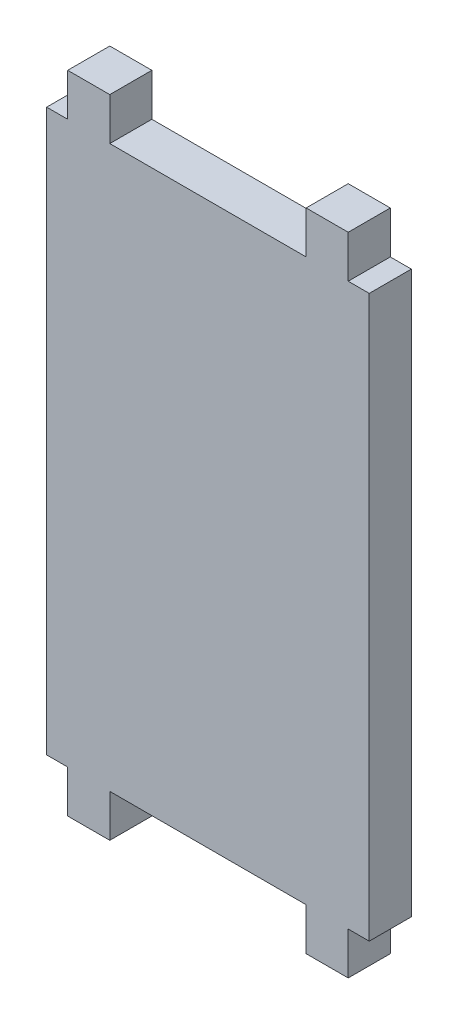
ISO-10303-21;
HEADER;
FILE_DESCRIPTION(('STEP AP214'),'2;1');
FILE_NAME('part.step','',(''),(''),'','','');
FILE_SCHEMA(('AUTOMOTIVE_DESIGN { 1 0 10303 214 1 1 1 1 }'));
ENDSEC;
DATA;
#1=APPLICATION_CONTEXT('core data for automotive mechanical design processes');
#2=APPLICATION_PROTOCOL_DEFINITION('international standard','automotive_design',2000,#1);
#3=PRODUCT_CONTEXT('',#1,'mechanical');
#4=PRODUCT('Part','Part','',(#3));
#5=PRODUCT_RELATED_PRODUCT_CATEGORY('part','',(#4));
#6=PRODUCT_DEFINITION_FORMATION('','',#4);
#7=PRODUCT_DEFINITION_CONTEXT('part definition',#1,'design');
#8=PRODUCT_DEFINITION('design','',#6,#7);
#9=PRODUCT_DEFINITION_SHAPE('','',#8);
#10=(LENGTH_UNIT() NAMED_UNIT(*) SI_UNIT(.MILLI.,.METRE.));
#11=(NAMED_UNIT(*) PLANE_ANGLE_UNIT() SI_UNIT($,.RADIAN.));
#12=(NAMED_UNIT(*) SI_UNIT($,.STERADIAN.) SOLID_ANGLE_UNIT());
#13=UNCERTAINTY_MEASURE_WITH_UNIT(LENGTH_MEASURE(1.E-05),#10,'distance_accuracy_value','');
#14=(GEOMETRIC_REPRESENTATION_CONTEXT(3) GLOBAL_UNCERTAINTY_ASSIGNED_CONTEXT((#13)) GLOBAL_UNIT_ASSIGNED_CONTEXT((#10,
#11,#12)) REPRESENTATION_CONTEXT('',''));
#15=CARTESIAN_POINT('',(0.,0.,0.));
#16=DIRECTION('',(0.,0.,1.));
#17=DIRECTION('',(1.,0.,0.));
#18=AXIS2_PLACEMENT_3D('',#15,#16,#17);
#19=CARTESIAN_POINT('',(70.,90.,6.));
#20=DIRECTION('',(0.,-1.,0.));
#21=DIRECTION('',(0.,0.,-1.));
#22=AXIS2_PLACEMENT_3D('',#19,#20,#21);
#23=PLANE('',#22);
#24=DIRECTION('',(-1.,0.,0.));
#25=VECTOR('',#24,1.);
#26=CARTESIAN_POINT('',(70.,90.,0.));
#27=LINE('',#26,#25);
#28=CARTESIAN_POINT('',(73.,90.,0.));
#29=VERTEX_POINT('',#28);
#30=CARTESIAN_POINT('',(70.,90.,0.));
#31=VERTEX_POINT('',#30);
#32=EDGE_CURVE('E202',#29,#31,#27,.T.);
#33=ORIENTED_EDGE('',*,*,#32,.T.);
#34=DIRECTION('',(0.,0.,-1.));
#35=VECTOR('',#34,1.);
#36=CARTESIAN_POINT('',(70.,90.,6.));
#37=LINE('',#36,#35);
#38=CARTESIAN_POINT('',(70.,90.,6.));
#39=VERTEX_POINT('',#38);
#40=EDGE_CURVE('E11',#39,#31,#37,.T.);
#41=ORIENTED_EDGE('',*,*,#40,.F.);
#42=DIRECTION('',(-1.,0.,0.));
#43=VECTOR('',#42,1.);
#44=CARTESIAN_POINT('',(70.,90.,6.));
#45=LINE('',#44,#43);
#46=CARTESIAN_POINT('',(73.,90.,6.));
#47=VERTEX_POINT('',#46);
#48=EDGE_CURVE('E240',#47,#39,#45,.T.);
#49=ORIENTED_EDGE('',*,*,#48,.F.);
#50=DIRECTION('',(0.,0.,-1.));
#51=VECTOR('',#50,1.);
#52=CARTESIAN_POINT('',(73.,90.,6.));
#53=LINE('',#52,#51);
#54=EDGE_CURVE('E198',#47,#29,#53,.T.);
#55=ORIENTED_EDGE('',*,*,#54,.T.);
#56=EDGE_LOOP('',(#33,#41,#49,#55));
#57=FACE_BOUND('',#56,.T.);
#58=ADVANCED_FACE('F34',(#57),#23,.F.);
#59=CARTESIAN_POINT('',(70.,96.05,6.));
#60=DIRECTION('',(-1.,0.,0.));
#61=DIRECTION('',(0.,0.,1.));
#62=AXIS2_PLACEMENT_3D('',#59,#60,#61);
#63=PLANE('',#62);
#64=DIRECTION('',(0.,1.,0.));
#65=VECTOR('',#64,1.);
#66=CARTESIAN_POINT('',(70.,96.05,0.));
#67=LINE('',#66,#65);
#68=CARTESIAN_POINT('',(70.,96.05,0.));
#69=VERTEX_POINT('',#68);
#70=EDGE_CURVE('E205',#31,#69,#67,.T.);
#71=ORIENTED_EDGE('',*,*,#70,.T.);
#72=DIRECTION('',(0.,0.,-1.));
#73=VECTOR('',#72,1.);
#74=CARTESIAN_POINT('',(70.,96.05,6.));
#75=LINE('',#74,#73);
#76=CARTESIAN_POINT('',(70.,96.05,6.));
#77=VERTEX_POINT('',#76);
#78=EDGE_CURVE('E42',#77,#69,#75,.T.);
#79=ORIENTED_EDGE('',*,*,#78,.F.);
#80=DIRECTION('',(0.,1.,0.));
#81=VECTOR('',#80,1.);
#82=CARTESIAN_POINT('',(70.,96.05,6.));
#83=LINE('',#82,#81);
#84=EDGE_CURVE('E129',#39,#77,#83,.T.);
#85=ORIENTED_EDGE('',*,*,#84,.F.);
#86=ORIENTED_EDGE('',*,*,#40,.T.);
#87=EDGE_LOOP('',(#71,#79,#85,#86));
#88=FACE_BOUND('',#87,.T.);
#89=ADVANCED_FACE('F358',(#88),#63,.F.);
#90=CARTESIAN_POINT('',(64.,96.05,6.));
#91=DIRECTION('',(0.,-1.,0.));
#92=DIRECTION('',(0.,0.,-1.));
#93=AXIS2_PLACEMENT_3D('',#90,#91,#92);
#94=PLANE('',#93);
#95=DIRECTION('',(-1.,0.,0.));
#96=VECTOR('',#95,1.);
#97=CARTESIAN_POINT('',(64.,96.05,0.));
#98=LINE('',#97,#96);
#99=CARTESIAN_POINT('',(64.,96.05,0.));
#100=VERTEX_POINT('',#99);
#101=EDGE_CURVE('E207',#69,#100,#98,.T.);
#102=ORIENTED_EDGE('',*,*,#101,.T.);
#103=DIRECTION('',(0.,0.,-1.));
#104=VECTOR('',#103,1.);
#105=CARTESIAN_POINT('',(64.,96.05,6.));
#106=LINE('',#105,#104);
#107=CARTESIAN_POINT('',(64.,96.05,6.));
#108=VERTEX_POINT('',#107);
#109=EDGE_CURVE('E283',#108,#100,#106,.T.);
#110=ORIENTED_EDGE('',*,*,#109,.F.);
#111=DIRECTION('',(-1.,0.,0.));
#112=VECTOR('',#111,1.);
#113=CARTESIAN_POINT('',(64.,96.05,6.));
#114=LINE('',#113,#112);
#115=EDGE_CURVE('E291',#77,#108,#114,.T.);
#116=ORIENTED_EDGE('',*,*,#115,.F.);
#117=ORIENTED_EDGE('',*,*,#78,.T.);
#118=EDGE_LOOP('',(#102,#110,#116,#117));
#119=FACE_BOUND('',#118,.T.);
#120=ADVANCED_FACE('F289',(#119),#94,.F.);
#121=CARTESIAN_POINT('',(64.,96.05,6.));
#122=DIRECTION('',(1.,0.,0.));
#123=DIRECTION('',(0.,0.,-1.));
#124=AXIS2_PLACEMENT_3D('',#121,#122,#123);
#125=PLANE('',#124);
#126=DIRECTION('',(0.,-1.,0.));
#127=VECTOR('',#126,1.);
#128=CARTESIAN_POINT('',(64.,96.05,0.));
#129=LINE('',#128,#127);
#130=CARTESIAN_POINT('',(64.,90.,0.));
#131=VERTEX_POINT('',#130);
#132=EDGE_CURVE('E209',#100,#131,#129,.T.);
#133=ORIENTED_EDGE('',*,*,#132,.T.);
#134=DIRECTION('',(0.,0.,-1.));
#135=VECTOR('',#134,1.);
#136=CARTESIAN_POINT('',(64.,90.,6.));
#137=LINE('',#136,#135);
#138=CARTESIAN_POINT('',(64.,90.,6.));
#139=VERTEX_POINT('',#138);
#140=EDGE_CURVE('E280',#139,#131,#137,.T.);
#141=ORIENTED_EDGE('',*,*,#140,.F.);
#142=DIRECTION('',(0.,-1.,0.));
#143=VECTOR('',#142,1.);
#144=CARTESIAN_POINT('',(64.,96.05,6.));
#145=LINE('',#144,#143);
#146=EDGE_CURVE('E309',#108,#139,#145,.T.);
#147=ORIENTED_EDGE('',*,*,#146,.F.);
#148=ORIENTED_EDGE('',*,*,#109,.T.);
#149=EDGE_LOOP('',(#133,#141,#147,#148));
#150=FACE_BOUND('',#149,.T.);
#151=ADVANCED_FACE('F300',(#150),#125,.F.);
#152=CARTESIAN_POINT('',(36.,90.,6.));
#153=DIRECTION('',(0.,-1.,0.));
#154=DIRECTION('',(1.,0.,0.));
#155=AXIS2_PLACEMENT_3D('',#152,#153,#154);
#156=PLANE('',#155);
#157=DIRECTION('',(-1.,0.,0.));
#158=VECTOR('',#157,1.);
#159=CARTESIAN_POINT('',(36.,90.,0.));
#160=LINE('',#159,#158);
#161=CARTESIAN_POINT('',(36.,90.,0.));
#162=VERTEX_POINT('',#161);
#163=EDGE_CURVE('E211',#131,#162,#160,.T.);
#164=ORIENTED_EDGE('',*,*,#163,.T.);
#165=DIRECTION('',(0.,0.,-1.));
#166=VECTOR('',#165,1.);
#167=CARTESIAN_POINT('',(36.,90.,6.));
#168=LINE('',#167,#166);
#169=CARTESIAN_POINT('',(36.,90.,6.));
#170=VERTEX_POINT('',#169);
#171=EDGE_CURVE('E277',#170,#162,#168,.T.);
#172=ORIENTED_EDGE('',*,*,#171,.F.);
#173=DIRECTION('',(-1.,0.,0.));
#174=VECTOR('',#173,1.);
#175=CARTESIAN_POINT('',(36.,90.,6.));
#176=LINE('',#175,#174);
#177=EDGE_CURVE('E306',#139,#170,#176,.T.);
#178=ORIENTED_EDGE('',*,*,#177,.F.);
#179=ORIENTED_EDGE('',*,*,#140,.T.);
#180=EDGE_LOOP('',(#164,#172,#178,#179));
#181=FACE_BOUND('',#180,.T.);
#182=ADVANCED_FACE('F304',(#181),#156,.F.);
#183=CARTESIAN_POINT('',(36.,96.05,6.));
#184=DIRECTION('',(-1.,0.,0.));
#185=DIRECTION('',(0.,0.,1.));
#186=AXIS2_PLACEMENT_3D('',#183,#184,#185);
#187=PLANE('',#186);
#188=DIRECTION('',(0.,1.,0.));
#189=VECTOR('',#188,1.);
#190=CARTESIAN_POINT('',(36.,96.05,0.));
#191=LINE('',#190,#189);
#192=CARTESIAN_POINT('',(36.,96.05,0.));
#193=VERTEX_POINT('',#192);
#194=EDGE_CURVE('E213',#162,#193,#191,.T.);
#195=ORIENTED_EDGE('',*,*,#194,.T.);
#196=DIRECTION('',(0.,0.,-1.));
#197=VECTOR('',#196,1.);
#198=CARTESIAN_POINT('',(36.,96.05,6.));
#199=LINE('',#198,#197);
#200=CARTESIAN_POINT('',(36.,96.05,6.));
#201=VERTEX_POINT('',#200);
#202=EDGE_CURVE('E274',#201,#193,#199,.T.);
#203=ORIENTED_EDGE('',*,*,#202,.F.);
#204=DIRECTION('',(0.,1.,0.));
#205=VECTOR('',#204,1.);
#206=CARTESIAN_POINT('',(36.,96.05,6.));
#207=LINE('',#206,#205);
#208=EDGE_CURVE('E308',#170,#201,#207,.T.);
#209=ORIENTED_EDGE('',*,*,#208,.F.);
#210=ORIENTED_EDGE('',*,*,#171,.T.);
#211=EDGE_LOOP('',(#195,#203,#209,#210));
#212=FACE_BOUND('',#211,.T.);
#213=ADVANCED_FACE('F371',(#212),#187,.F.);
#214=CARTESIAN_POINT('',(30.,96.05,6.));
#215=DIRECTION('',(0.,-1.,0.));
#216=DIRECTION('',(0.,0.,-1.));
#217=AXIS2_PLACEMENT_3D('',#214,#215,#216);
#218=PLANE('',#217);
#219=DIRECTION('',(-1.,0.,0.));
#220=VECTOR('',#219,1.);
#221=CARTESIAN_POINT('',(30.,96.05,0.));
#222=LINE('',#221,#220);
#223=CARTESIAN_POINT('',(30.,96.05,0.));
#224=VERTEX_POINT('',#223);
#225=EDGE_CURVE('E215',#193,#224,#222,.T.);
#226=ORIENTED_EDGE('',*,*,#225,.T.);
#227=DIRECTION('',(0.,0.,-1.));
#228=VECTOR('',#227,1.);
#229=CARTESIAN_POINT('',(30.,96.05,6.));
#230=LINE('',#229,#228);
#231=CARTESIAN_POINT('',(30.,96.05,6.));
#232=VERTEX_POINT('',#231);
#233=EDGE_CURVE('E271',#232,#224,#230,.T.);
#234=ORIENTED_EDGE('',*,*,#233,.F.);
#235=DIRECTION('',(-1.,0.,0.));
#236=VECTOR('',#235,1.);
#237=CARTESIAN_POINT('',(30.,96.05,6.));
#238=LINE('',#237,#236);
#239=EDGE_CURVE('E311',#201,#232,#238,.T.);
#240=ORIENTED_EDGE('',*,*,#239,.F.);
#241=ORIENTED_EDGE('',*,*,#202,.T.);
#242=EDGE_LOOP('',(#226,#234,#240,#241));
#243=FACE_BOUND('',#242,.T.);
#244=ADVANCED_FACE('F374',(#243),#218,.F.);
#245=CARTESIAN_POINT('',(30.,96.05,6.));
#246=DIRECTION('',(1.,0.,0.));
#247=DIRECTION('',(0.,0.,-1.));
#248=AXIS2_PLACEMENT_3D('',#245,#246,#247);
#249=PLANE('',#248);
#250=DIRECTION('',(0.,-1.,0.));
#251=VECTOR('',#250,1.);
#252=CARTESIAN_POINT('',(30.,96.05,0.));
#253=LINE('',#252,#251);
#254=CARTESIAN_POINT('',(30.,90.,0.));
#255=VERTEX_POINT('',#254);
#256=EDGE_CURVE('E217',#224,#255,#253,.T.);
#257=ORIENTED_EDGE('',*,*,#256,.T.);
#258=DIRECTION('',(0.,0.,-1.));
#259=VECTOR('',#258,1.);
#260=CARTESIAN_POINT('',(30.,90.,6.));
#261=LINE('',#260,#259);
#262=CARTESIAN_POINT('',(30.,90.,6.));
#263=VERTEX_POINT('',#262);
#264=EDGE_CURVE('E268',#263,#255,#261,.T.);
#265=ORIENTED_EDGE('',*,*,#264,.F.);
#266=DIRECTION('',(0.,-1.,0.));
#267=VECTOR('',#266,1.);
#268=CARTESIAN_POINT('',(30.,96.05,6.));
#269=LINE('',#268,#267);
#270=EDGE_CURVE('E317',#232,#263,#269,.T.);
#271=ORIENTED_EDGE('',*,*,#270,.F.);
#272=ORIENTED_EDGE('',*,*,#233,.T.);
#273=EDGE_LOOP('',(#257,#265,#271,#272));
#274=FACE_BOUND('',#273,.T.);
#275=ADVANCED_FACE('F378',(#274),#249,.F.);
#276=CARTESIAN_POINT('',(27.,90.,6.));
#277=DIRECTION('',(0.,-1.,0.));
#278=DIRECTION('',(0.,0.,-1.));
#279=AXIS2_PLACEMENT_3D('',#276,#277,#278);
#280=PLANE('',#279);
#281=DIRECTION('',(-1.,0.,0.));
#282=VECTOR('',#281,1.);
#283=CARTESIAN_POINT('',(27.,90.,0.));
#284=LINE('',#283,#282);
#285=CARTESIAN_POINT('',(27.,90.,0.));
#286=VERTEX_POINT('',#285);
#287=EDGE_CURVE('E219',#255,#286,#284,.T.);
#288=ORIENTED_EDGE('',*,*,#287,.T.);
#289=DIRECTION('',(0.,0.,-1.));
#290=VECTOR('',#289,1.);
#291=CARTESIAN_POINT('',(27.,90.,6.));
#292=LINE('',#291,#290);
#293=CARTESIAN_POINT('',(27.,90.,6.));
#294=VERTEX_POINT('',#293);
#295=EDGE_CURVE('E265',#294,#286,#292,.T.);
#296=ORIENTED_EDGE('',*,*,#295,.F.);
#297=DIRECTION('',(-1.,0.,0.));
#298=VECTOR('',#297,1.);
#299=CARTESIAN_POINT('',(27.,90.,6.));
#300=LINE('',#299,#298);
#301=EDGE_CURVE('E319',#263,#294,#300,.T.);
#302=ORIENTED_EDGE('',*,*,#301,.F.);
#303=ORIENTED_EDGE('',*,*,#264,.T.);
#304=EDGE_LOOP('',(#288,#296,#302,#303));
#305=FACE_BOUND('',#304,.T.);
#306=ADVANCED_FACE('F382',(#305),#280,.F.);
#307=CARTESIAN_POINT('',(27.,90.,6.));
#308=DIRECTION('',(1.,0.,0.));
#309=DIRECTION('',(0.,1.,0.));
#310=AXIS2_PLACEMENT_3D('',#307,#308,#309);
#311=PLANE('',#310);
#312=DIRECTION('',(0.,-1.,0.));
#313=VECTOR('',#312,1.);
#314=CARTESIAN_POINT('',(27.,90.,0.));
#315=LINE('',#314,#313);
#316=CARTESIAN_POINT('',(27.,9.99999999999997,0.));
#317=VERTEX_POINT('',#316);
#318=EDGE_CURVE('E221',#286,#317,#315,.T.);
#319=ORIENTED_EDGE('',*,*,#318,.T.);
#320=DIRECTION('',(0.,0.,-1.));
#321=VECTOR('',#320,1.);
#322=CARTESIAN_POINT('',(27.,9.99999999999997,6.));
#323=LINE('',#322,#321);
#324=CARTESIAN_POINT('',(27.,9.99999999999997,6.));
#325=VERTEX_POINT('',#324);
#326=EDGE_CURVE('E262',#325,#317,#323,.T.);
#327=ORIENTED_EDGE('',*,*,#326,.F.);
#328=DIRECTION('',(0.,-1.,0.));
#329=VECTOR('',#328,1.);
#330=CARTESIAN_POINT('',(27.,90.,6.));
#331=LINE('',#330,#329);
#332=EDGE_CURVE('E321',#294,#325,#331,.T.);
#333=ORIENTED_EDGE('',*,*,#332,.F.);
#334=ORIENTED_EDGE('',*,*,#295,.T.);
#335=EDGE_LOOP('',(#319,#327,#333,#334));
#336=FACE_BOUND('',#335,.T.);
#337=ADVANCED_FACE('F386',(#336),#311,.F.);
#338=CARTESIAN_POINT('',(27.,9.99999999999997,6.));
#339=DIRECTION('',(0.,1.,0.));
#340=DIRECTION('',(0.,0.,1.));
#341=AXIS2_PLACEMENT_3D('',#338,#339,#340);
#342=PLANE('',#341);
#343=DIRECTION('',(1.,0.,0.));
#344=VECTOR('',#343,1.);
#345=CARTESIAN_POINT('',(27.,9.99999999999997,0.));
#346=LINE('',#345,#344);
#347=CARTESIAN_POINT('',(30.,9.99999999999997,0.));
#348=VERTEX_POINT('',#347);
#349=EDGE_CURVE('E223',#317,#348,#346,.T.);
#350=ORIENTED_EDGE('',*,*,#349,.T.);
#351=DIRECTION('',(0.,0.,-1.));
#352=VECTOR('',#351,1.);
#353=CARTESIAN_POINT('',(30.,9.99999999999997,6.));
#354=LINE('',#353,#352);
#355=CARTESIAN_POINT('',(30.,9.99999999999997,6.));
#356=VERTEX_POINT('',#355);
#357=EDGE_CURVE('E259',#356,#348,#354,.T.);
#358=ORIENTED_EDGE('',*,*,#357,.F.);
#359=DIRECTION('',(1.,0.,0.));
#360=VECTOR('',#359,1.);
#361=CARTESIAN_POINT('',(27.,9.99999999999997,6.));
#362=LINE('',#361,#360);
#363=EDGE_CURVE('E323',#325,#356,#362,.T.);
#364=ORIENTED_EDGE('',*,*,#363,.F.);
#365=ORIENTED_EDGE('',*,*,#326,.T.);
#366=EDGE_LOOP('',(#350,#358,#364,#365));
#367=FACE_BOUND('',#366,.T.);
#368=ADVANCED_FACE('F390',(#367),#342,.F.);
#369=CARTESIAN_POINT('',(30.,9.99999999999997,6.));
#370=DIRECTION('',(1.,0.,0.));
#371=DIRECTION('',(0.,0.,-1.));
#372=AXIS2_PLACEMENT_3D('',#369,#370,#371);
#373=PLANE('',#372);
#374=DIRECTION('',(0.,-1.,0.));
#375=VECTOR('',#374,1.);
#376=CARTESIAN_POINT('',(30.,9.99999999999997,0.));
#377=LINE('',#376,#375);
#378=CARTESIAN_POINT('',(30.,3.94999999999996,0.));
#379=VERTEX_POINT('',#378);
#380=EDGE_CURVE('E225',#348,#379,#377,.T.);
#381=ORIENTED_EDGE('',*,*,#380,.T.);
#382=DIRECTION('',(0.,0.,-1.));
#383=VECTOR('',#382,1.);
#384=CARTESIAN_POINT('',(30.,3.94999999999996,6.));
#385=LINE('',#384,#383);
#386=CARTESIAN_POINT('',(30.,3.94999999999996,6.));
#387=VERTEX_POINT('',#386);
#388=EDGE_CURVE('E256',#387,#379,#385,.T.);
#389=ORIENTED_EDGE('',*,*,#388,.F.);
#390=DIRECTION('',(0.,-1.,0.));
#391=VECTOR('',#390,1.);
#392=CARTESIAN_POINT('',(30.,9.99999999999997,6.));
#393=LINE('',#392,#391);
#394=EDGE_CURVE('E325',#356,#387,#393,.T.);
#395=ORIENTED_EDGE('',*,*,#394,.F.);
#396=ORIENTED_EDGE('',*,*,#357,.T.);
#397=EDGE_LOOP('',(#381,#389,#395,#396));
#398=FACE_BOUND('',#397,.T.);
#399=ADVANCED_FACE('F394',(#398),#373,.F.);
#400=CARTESIAN_POINT('',(30.,3.94999999999996,6.));
#401=DIRECTION('',(0.,1.,0.));
#402=DIRECTION('',(0.,0.,1.));
#403=AXIS2_PLACEMENT_3D('',#400,#401,#402);
#404=PLANE('',#403);
#405=DIRECTION('',(1.,0.,0.));
#406=VECTOR('',#405,1.);
#407=CARTESIAN_POINT('',(30.,3.94999999999996,0.));
#408=LINE('',#407,#406);
#409=CARTESIAN_POINT('',(36.,3.94999999999996,0.));
#410=VERTEX_POINT('',#409);
#411=EDGE_CURVE('E227',#379,#410,#408,.T.);
#412=ORIENTED_EDGE('',*,*,#411,.T.);
#413=DIRECTION('',(0.,0.,-1.));
#414=VECTOR('',#413,1.);
#415=CARTESIAN_POINT('',(36.,3.94999999999996,6.));
#416=LINE('',#415,#414);
#417=CARTESIAN_POINT('',(36.,3.94999999999996,6.));
#418=VERTEX_POINT('',#417);
#419=EDGE_CURVE('E253',#418,#410,#416,.T.);
#420=ORIENTED_EDGE('',*,*,#419,.F.);
#421=DIRECTION('',(1.,0.,0.));
#422=VECTOR('',#421,1.);
#423=CARTESIAN_POINT('',(30.,3.94999999999996,6.));
#424=LINE('',#423,#422);
#425=EDGE_CURVE('E327',#387,#418,#424,.T.);
#426=ORIENTED_EDGE('',*,*,#425,.F.);
#427=ORIENTED_EDGE('',*,*,#388,.T.);
#428=EDGE_LOOP('',(#412,#420,#426,#427));
#429=FACE_BOUND('',#428,.T.);
#430=ADVANCED_FACE('F398',(#429),#404,.F.);
#431=CARTESIAN_POINT('',(36.,9.99999999999997,6.));
#432=DIRECTION('',(-1.,0.,0.));
#433=DIRECTION('',(0.,0.,1.));
#434=AXIS2_PLACEMENT_3D('',#431,#432,#433);
#435=PLANE('',#434);
#436=DIRECTION('',(0.,1.,0.));
#437=VECTOR('',#436,1.);
#438=CARTESIAN_POINT('',(36.,9.99999999999997,0.));
#439=LINE('',#438,#437);
#440=CARTESIAN_POINT('',(36.,9.99999999999997,0.));
#441=VERTEX_POINT('',#440);
#442=EDGE_CURVE('E229',#410,#441,#439,.T.);
#443=ORIENTED_EDGE('',*,*,#442,.T.);
#444=DIRECTION('',(0.,0.,-1.));
#445=VECTOR('',#444,1.);
#446=CARTESIAN_POINT('',(36.,9.99999999999997,6.));
#447=LINE('',#446,#445);
#448=CARTESIAN_POINT('',(36.,9.99999999999997,6.));
#449=VERTEX_POINT('',#448);
#450=EDGE_CURVE('E250',#449,#441,#447,.T.);
#451=ORIENTED_EDGE('',*,*,#450,.F.);
#452=DIRECTION('',(0.,1.,0.));
#453=VECTOR('',#452,1.);
#454=CARTESIAN_POINT('',(36.,9.99999999999997,6.));
#455=LINE('',#454,#453);
#456=EDGE_CURVE('E329',#418,#449,#455,.T.);
#457=ORIENTED_EDGE('',*,*,#456,.F.);
#458=ORIENTED_EDGE('',*,*,#419,.T.);
#459=EDGE_LOOP('',(#443,#451,#457,#458));
#460=FACE_BOUND('',#459,.T.);
#461=ADVANCED_FACE('F402',(#460),#435,.F.);
#462=CARTESIAN_POINT('',(36.,9.99999999999997,6.));
#463=DIRECTION('',(0.,1.,0.));
#464=DIRECTION('',(-1.,0.,0.));
#465=AXIS2_PLACEMENT_3D('',#462,#463,#464);
#466=PLANE('',#465);
#467=DIRECTION('',(1.,0.,0.));
#468=VECTOR('',#467,1.);
#469=CARTESIAN_POINT('',(36.,9.99999999999997,0.));
#470=LINE('',#469,#468);
#471=CARTESIAN_POINT('',(64.,10.,0.));
#472=VERTEX_POINT('',#471);
#473=EDGE_CURVE('E231',#441,#472,#470,.T.);
#474=ORIENTED_EDGE('',*,*,#473,.T.);
#475=DIRECTION('',(0.,0.,-1.));
#476=VECTOR('',#475,1.);
#477=CARTESIAN_POINT('',(64.,10.,6.));
#478=LINE('',#477,#476);
#479=CARTESIAN_POINT('',(64.,10.,6.));
#480=VERTEX_POINT('',#479);
#481=EDGE_CURVE('E247',#480,#472,#478,.T.);
#482=ORIENTED_EDGE('',*,*,#481,.F.);
#483=DIRECTION('',(1.,0.,0.));
#484=VECTOR('',#483,1.);
#485=CARTESIAN_POINT('',(36.,9.99999999999997,6.));
#486=LINE('',#485,#484);
#487=EDGE_CURVE('E331',#449,#480,#486,.T.);
#488=ORIENTED_EDGE('',*,*,#487,.F.);
#489=ORIENTED_EDGE('',*,*,#450,.T.);
#490=EDGE_LOOP('',(#474,#482,#488,#489));
#491=FACE_BOUND('',#490,.T.);
#492=ADVANCED_FACE('F406',(#491),#466,.F.);
#493=CARTESIAN_POINT('',(64.,10.,6.));
#494=DIRECTION('',(1.,0.,0.));
#495=DIRECTION('',(0.,0.,-1.));
#496=AXIS2_PLACEMENT_3D('',#493,#494,#495);
#497=PLANE('',#496);
#498=DIRECTION('',(0.,-1.,0.));
#499=VECTOR('',#498,1.);
#500=CARTESIAN_POINT('',(64.,10.,0.));
#501=LINE('',#500,#499);
#502=CARTESIAN_POINT('',(64.,3.94999999999999,0.));
#503=VERTEX_POINT('',#502);
#504=EDGE_CURVE('E233',#472,#503,#501,.T.);
#505=ORIENTED_EDGE('',*,*,#504,.T.);
#506=DIRECTION('',(0.,0.,-1.));
#507=VECTOR('',#506,1.);
#508=CARTESIAN_POINT('',(64.,3.94999999999999,6.));
#509=LINE('',#508,#507);
#510=CARTESIAN_POINT('',(64.,3.94999999999999,6.));
#511=VERTEX_POINT('',#510);
#512=EDGE_CURVE('E244',#511,#503,#509,.T.);
#513=ORIENTED_EDGE('',*,*,#512,.F.);
#514=DIRECTION('',(0.,-1.,0.));
#515=VECTOR('',#514,1.);
#516=CARTESIAN_POINT('',(64.,10.,6.));
#517=LINE('',#516,#515);
#518=EDGE_CURVE('E333',#480,#511,#517,.T.);
#519=ORIENTED_EDGE('',*,*,#518,.F.);
#520=ORIENTED_EDGE('',*,*,#481,.T.);
#521=EDGE_LOOP('',(#505,#513,#519,#520));
#522=FACE_BOUND('',#521,.T.);
#523=ADVANCED_FACE('F339',(#522),#497,.F.);
#524=CARTESIAN_POINT('',(64.,3.94999999999999,6.));
#525=DIRECTION('',(0.,1.,0.));
#526=DIRECTION('',(0.,0.,1.));
#527=AXIS2_PLACEMENT_3D('',#524,#525,#526);
#528=PLANE('',#527);
#529=DIRECTION('',(1.,0.,0.));
#530=VECTOR('',#529,1.);
#531=CARTESIAN_POINT('',(64.,3.94999999999999,0.));
#532=LINE('',#531,#530);
#533=CARTESIAN_POINT('',(70.,3.94999999999999,0.));
#534=VERTEX_POINT('',#533);
#535=EDGE_CURVE('E235',#503,#534,#532,.T.);
#536=ORIENTED_EDGE('',*,*,#535,.T.);
#537=DIRECTION('',(0.,0.,-1.));
#538=VECTOR('',#537,1.);
#539=CARTESIAN_POINT('',(70.,3.94999999999999,6.));
#540=LINE('',#539,#538);
#541=CARTESIAN_POINT('',(70.,3.94999999999999,6.));
#542=VERTEX_POINT('',#541);
#543=EDGE_CURVE('E193',#542,#534,#540,.T.);
#544=ORIENTED_EDGE('',*,*,#543,.F.);
#545=DIRECTION('',(1.,0.,0.));
#546=VECTOR('',#545,1.);
#547=CARTESIAN_POINT('',(64.,3.94999999999999,6.));
#548=LINE('',#547,#546);
#549=EDGE_CURVE('E184',#511,#542,#548,.T.);
#550=ORIENTED_EDGE('',*,*,#549,.F.);
#551=ORIENTED_EDGE('',*,*,#512,.T.);
#552=EDGE_LOOP('',(#536,#544,#550,#551));
#553=FACE_BOUND('',#552,.T.);
#554=ADVANCED_FACE('F343',(#553),#528,.F.);
#555=CARTESIAN_POINT('',(70.,10.,6.));
#556=DIRECTION('',(-1.,0.,0.));
#557=DIRECTION('',(0.,0.,1.));
#558=AXIS2_PLACEMENT_3D('',#555,#556,#557);
#559=PLANE('',#558);
#560=DIRECTION('',(0.,1.,0.));
#561=VECTOR('',#560,1.);
#562=CARTESIAN_POINT('',(70.,10.,0.));
#563=LINE('',#562,#561);
#564=CARTESIAN_POINT('',(70.,10.,0.));
#565=VERTEX_POINT('',#564);
#566=EDGE_CURVE('E192',#534,#565,#563,.T.);
#567=ORIENTED_EDGE('',*,*,#566,.T.);
#568=DIRECTION('',(0.,0.,-1.));
#569=VECTOR('',#568,1.);
#570=CARTESIAN_POINT('',(70.,10.,6.));
#571=LINE('',#570,#569);
#572=CARTESIAN_POINT('',(70.,10.,6.));
#573=VERTEX_POINT('',#572);
#574=EDGE_CURVE('E189',#573,#565,#571,.T.);
#575=ORIENTED_EDGE('',*,*,#574,.F.);
#576=DIRECTION('',(0.,1.,0.));
#577=VECTOR('',#576,1.);
#578=CARTESIAN_POINT('',(70.,10.,6.));
#579=LINE('',#578,#577);
#580=EDGE_CURVE('E178',#542,#573,#579,.T.);
#581=ORIENTED_EDGE('',*,*,#580,.F.);
#582=ORIENTED_EDGE('',*,*,#543,.T.);
#583=EDGE_LOOP('',(#567,#575,#581,#582));
#584=FACE_BOUND('',#583,.T.);
#585=ADVANCED_FACE('F190',(#584),#559,.F.);
#586=CARTESIAN_POINT('',(70.,10.,6.));
#587=DIRECTION('',(0.,1.,0.));
#588=DIRECTION('',(0.,0.,1.));
#589=AXIS2_PLACEMENT_3D('',#586,#587,#588);
#590=PLANE('',#589);
#591=DIRECTION('',(1.,0.,0.));
#592=VECTOR('',#591,1.);
#593=CARTESIAN_POINT('',(70.,10.,0.));
#594=LINE('',#593,#592);
#595=CARTESIAN_POINT('',(73.,10.,0.));
#596=VERTEX_POINT('',#595);
#597=EDGE_CURVE('E115',#565,#596,#594,.T.);
#598=ORIENTED_EDGE('',*,*,#597,.T.);
#599=DIRECTION('',(0.,0.,-1.));
#600=VECTOR('',#599,1.);
#601=CARTESIAN_POINT('',(73.,10.,6.));
#602=LINE('',#601,#600);
#603=CARTESIAN_POINT('',(73.,10.,6.));
#604=VERTEX_POINT('',#603);
#605=EDGE_CURVE('E194',#604,#596,#602,.T.);
#606=ORIENTED_EDGE('',*,*,#605,.F.);
#607=DIRECTION('',(1.,0.,0.));
#608=VECTOR('',#607,1.);
#609=CARTESIAN_POINT('',(70.,10.,6.));
#610=LINE('',#609,#608);
#611=EDGE_CURVE('E182',#573,#604,#610,.T.);
#612=ORIENTED_EDGE('',*,*,#611,.F.);
#613=ORIENTED_EDGE('',*,*,#574,.T.);
#614=EDGE_LOOP('',(#598,#606,#612,#613));
#615=FACE_BOUND('',#614,.T.);
#616=ADVANCED_FACE('F196',(#615),#590,.F.);
#617=CARTESIAN_POINT('',(73.,90.,6.));
#618=DIRECTION('',(-1.,0.,0.));
#619=DIRECTION('',(0.,0.,1.));
#620=AXIS2_PLACEMENT_3D('',#617,#618,#619);
#621=PLANE('',#620);
#622=DIRECTION('',(0.,1.,0.));
#623=VECTOR('',#622,1.);
#624=CARTESIAN_POINT('',(73.,90.,0.));
#625=LINE('',#624,#623);
#626=EDGE_CURVE('E121',#596,#29,#625,.T.);
#627=ORIENTED_EDGE('',*,*,#626,.T.);
#628=ORIENTED_EDGE('',*,*,#54,.F.);
#629=DIRECTION('',(0.,1.,0.));
#630=VECTOR('',#629,1.);
#631=CARTESIAN_POINT('',(73.,90.,6.));
#632=LINE('',#631,#630);
#633=EDGE_CURVE('E50',#604,#47,#632,.T.);
#634=ORIENTED_EDGE('',*,*,#633,.F.);
#635=ORIENTED_EDGE('',*,*,#605,.T.);
#636=EDGE_LOOP('',(#627,#628,#634,#635));
#637=FACE_BOUND('',#636,.T.);
#638=ADVANCED_FACE('F347',(#637),#621,.F.);
#639=CARTESIAN_POINT('',(0.,0.,6.));
#640=DIRECTION('',(0.,0.,-1.));
#641=DIRECTION('',(-1.,0.,0.));
#642=AXIS2_PLACEMENT_3D('',#639,#640,#641);
#643=PLANE('',#642);
#644=ORIENTED_EDGE('',*,*,#48,.T.);
#645=ORIENTED_EDGE('',*,*,#84,.T.);
#646=ORIENTED_EDGE('',*,*,#115,.T.);
#647=ORIENTED_EDGE('',*,*,#146,.T.);
#648=ORIENTED_EDGE('',*,*,#177,.T.);
#649=ORIENTED_EDGE('',*,*,#208,.T.);
#650=ORIENTED_EDGE('',*,*,#239,.T.);
#651=ORIENTED_EDGE('',*,*,#270,.T.);
#652=ORIENTED_EDGE('',*,*,#301,.T.);
#653=ORIENTED_EDGE('',*,*,#332,.T.);
#654=ORIENTED_EDGE('',*,*,#363,.T.);
#655=ORIENTED_EDGE('',*,*,#394,.T.);
#656=ORIENTED_EDGE('',*,*,#425,.T.);
#657=ORIENTED_EDGE('',*,*,#456,.T.);
#658=ORIENTED_EDGE('',*,*,#487,.T.);
#659=ORIENTED_EDGE('',*,*,#518,.T.);
#660=ORIENTED_EDGE('',*,*,#549,.T.);
#661=ORIENTED_EDGE('',*,*,#580,.T.);
#662=ORIENTED_EDGE('',*,*,#611,.T.);
#663=ORIENTED_EDGE('',*,*,#633,.T.);
#664=EDGE_LOOP('',(#644,#645,#646,#647,#648,#649,#650,#651,#652,#653,#654,#655,#656,#657,#658,
#659,#660,#661,#662,#663));
#665=FACE_BOUND('',#664,.T.);
#666=ADVANCED_FACE('F180',(#665),#643,.F.);
#667=CARTESIAN_POINT('',(0.,0.,0.));
#668=DIRECTION('',(0.,0.,-1.));
#669=DIRECTION('',(-1.,0.,0.));
#670=AXIS2_PLACEMENT_3D('',#667,#668,#669);
#671=PLANE('',#670);
#672=ORIENTED_EDGE('',*,*,#32,.F.);
#673=ORIENTED_EDGE('',*,*,#626,.F.);
#674=ORIENTED_EDGE('',*,*,#597,.F.);
#675=ORIENTED_EDGE('',*,*,#566,.F.);
#676=ORIENTED_EDGE('',*,*,#535,.F.);
#677=ORIENTED_EDGE('',*,*,#504,.F.);
#678=ORIENTED_EDGE('',*,*,#473,.F.);
#679=ORIENTED_EDGE('',*,*,#442,.F.);
#680=ORIENTED_EDGE('',*,*,#411,.F.);
#681=ORIENTED_EDGE('',*,*,#380,.F.);
#682=ORIENTED_EDGE('',*,*,#349,.F.);
#683=ORIENTED_EDGE('',*,*,#318,.F.);
#684=ORIENTED_EDGE('',*,*,#287,.F.);
#685=ORIENTED_EDGE('',*,*,#256,.F.);
#686=ORIENTED_EDGE('',*,*,#225,.F.);
#687=ORIENTED_EDGE('',*,*,#194,.F.);
#688=ORIENTED_EDGE('',*,*,#163,.F.);
#689=ORIENTED_EDGE('',*,*,#132,.F.);
#690=ORIENTED_EDGE('',*,*,#101,.F.);
#691=ORIENTED_EDGE('',*,*,#70,.F.);
#692=EDGE_LOOP('',(#672,#673,#674,#675,#676,#677,#678,#679,#680,#681,#682,#683,#684,#685,#686,
#687,#688,#689,#690,#691));
#693=FACE_BOUND('',#692,.T.);
#694=ADVANCED_FACE('F295',(#693),#671,.T.);
#695=CLOSED_SHELL('',(#58,#89,#120,#151,#182,#213,#244,#275,#306,#337,#368,#399,#430,#461,#492,
#523,#554,#585,#616,#638,#666,#694));
#696=MANIFOLD_SOLID_BREP('B2',#695);
#697=ADVANCED_BREP_SHAPE_REPRESENTATION('',(#18,#696),#14);
#698=SHAPE_DEFINITION_REPRESENTATION(#9,#697);
ENDSEC;
END-ISO-10303-21;
